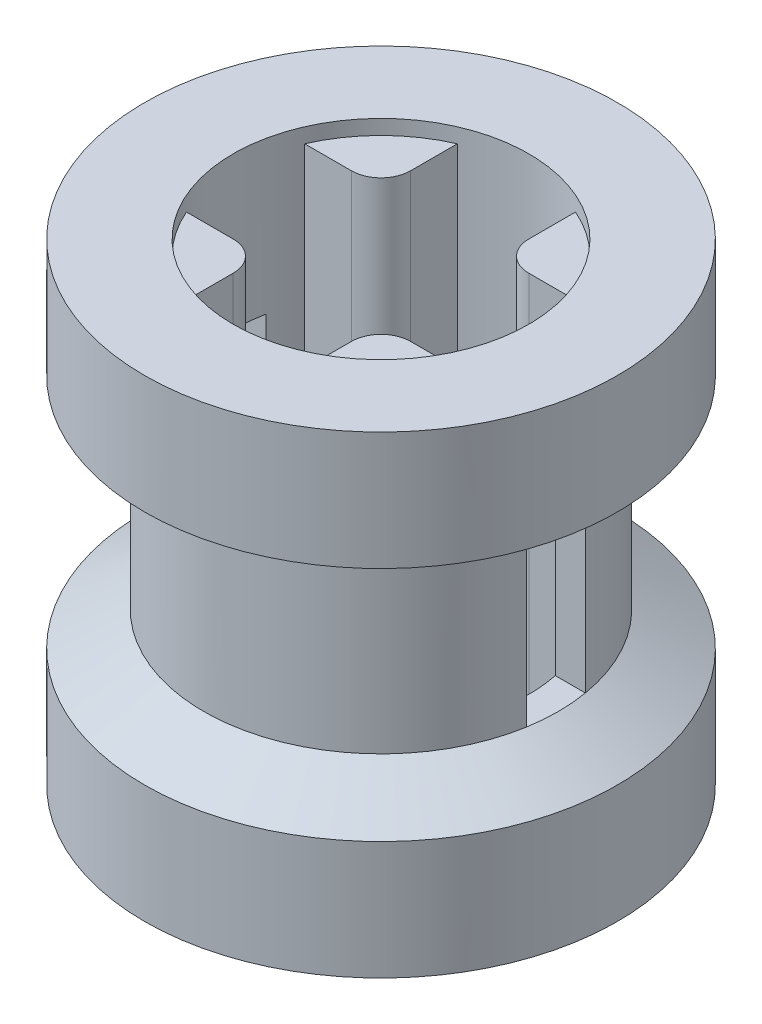
ISO-10303-21;
HEADER;
FILE_DESCRIPTION(('STEP AP214'),'2;1');
FILE_NAME('part.step','',(''),(''),'','','');
FILE_SCHEMA(('AUTOMOTIVE_DESIGN { 1 0 10303 214 1 1 1 1 }'));
ENDSEC;
DATA;
#1=APPLICATION_CONTEXT('core data for automotive mechanical design processes');
#2=APPLICATION_PROTOCOL_DEFINITION('international standard','automotive_design',2000,#1);
#3=PRODUCT_CONTEXT('',#1,'mechanical');
#4=PRODUCT('Part','Part','',(#3));
#5=PRODUCT_RELATED_PRODUCT_CATEGORY('part','',(#4));
#6=PRODUCT_DEFINITION_FORMATION('','',#4);
#7=PRODUCT_DEFINITION_CONTEXT('part definition',#1,'design');
#8=PRODUCT_DEFINITION('design','',#6,#7);
#9=PRODUCT_DEFINITION_SHAPE('','',#8);
#10=(LENGTH_UNIT() NAMED_UNIT(*) SI_UNIT(.MILLI.,.METRE.));
#11=(NAMED_UNIT(*) PLANE_ANGLE_UNIT() SI_UNIT($,.RADIAN.));
#12=(NAMED_UNIT(*) SI_UNIT($,.STERADIAN.) SOLID_ANGLE_UNIT());
#13=UNCERTAINTY_MEASURE_WITH_UNIT(LENGTH_MEASURE(1.E-05),#10,'distance_accuracy_value','');
#14=(GEOMETRIC_REPRESENTATION_CONTEXT(3) GLOBAL_UNCERTAINTY_ASSIGNED_CONTEXT((#13)) GLOBAL_UNIT_ASSIGNED_CONTEXT((#10,
#11,#12)) REPRESENTATION_CONTEXT('',''));
#15=CARTESIAN_POINT('',(0.,0.,0.));
#16=DIRECTION('',(0.,0.,1.));
#17=DIRECTION('',(1.,0.,0.));
#18=AXIS2_PLACEMENT_3D('',#15,#16,#17);
#19=CARTESIAN_POINT('',(0.,8.,0.));
#20=DIRECTION('',(0.,-1.,0.));
#21=DIRECTION('',(0.,0.,-1.));
#22=AXIS2_PLACEMENT_3D('',#19,#20,#21);
#23=CYLINDRICAL_SURFACE('',#22,2.5);
#24=CARTESIAN_POINT('',(0.,7.75,0.));
#25=DIRECTION('',(0.,1.,0.));
#26=DIRECTION('',(0.,0.,-1.));
#27=AXIS2_PLACEMENT_3D('',#24,#25,#26);
#28=CIRCLE('',#27,2.50000000000003);
#29=CARTESIAN_POINT('',(-1.00000000000005,7.75,-2.2912878474779));
#30=VERTEX_POINT('',#29);
#31=CARTESIAN_POINT('',(-2.29128784747792,7.75,-0.999999999999999));
#32=VERTEX_POINT('',#31);
#33=EDGE_CURVE('E377',#30,#32,#28,.T.);
#34=ORIENTED_EDGE('',*,*,#33,.F.);
#35=DIRECTION('',(0.,-1.,0.));
#36=VECTOR('',#35,1.);
#37=CARTESIAN_POINT('',(-1.00000000000005,7.75,-2.29128784747792));
#38=LINE('',#37,#36);
#39=CARTESIAN_POINT('',(-1.00000000000005,0.25,-2.29128784747792));
#40=VERTEX_POINT('',#39);
#41=EDGE_CURVE('E367',#30,#40,#38,.T.);
#42=ORIENTED_EDGE('',*,*,#41,.T.);
#43=CARTESIAN_POINT('',(0.,0.25,0.));
#44=DIRECTION('',(0.,1.,0.));
#45=DIRECTION('',(0.,0.,-1.));
#46=AXIS2_PLACEMENT_3D('',#43,#44,#45);
#47=CIRCLE('',#46,2.50000000000003);
#48=CARTESIAN_POINT('',(-2.29128784747793,0.25,-0.999999999999983));
#49=VERTEX_POINT('',#48);
#50=EDGE_CURVE('E325',#40,#49,#47,.T.);
#51=ORIENTED_EDGE('',*,*,#50,.T.);
#52=DIRECTION('',(0.,-1.,0.));
#53=VECTOR('',#52,1.);
#54=CARTESIAN_POINT('',(-2.29128784747797,7.75,-0.999999999999999));
#55=LINE('',#54,#53);
#56=EDGE_CURVE('E267',#32,#49,#55,.T.);
#57=ORIENTED_EDGE('',*,*,#56,.F.);
#58=EDGE_LOOP('',(#34,#42,#51,#57));
#59=FACE_BOUND('',#58,.T.);
#60=CARTESIAN_POINT('',(0.,7.75,0.));
#61=DIRECTION('',(0.,1.,0.));
#62=DIRECTION('',(0.,0.,-1.));
#63=AXIS2_PLACEMENT_3D('',#60,#61,#62);
#64=CIRCLE('',#63,2.50000000000003);
#65=CARTESIAN_POINT('',(-2.2912878474779,7.75,1.00000000000005));
#66=VERTEX_POINT('',#65);
#67=CARTESIAN_POINT('',(-1.00000000000004,7.75,2.2912878474779));
#68=VERTEX_POINT('',#67);
#69=EDGE_CURVE('E338',#66,#68,#64,.T.);
#70=ORIENTED_EDGE('',*,*,#69,.F.);
#71=DIRECTION('',(0.,-1.,0.));
#72=VECTOR('',#71,1.);
#73=CARTESIAN_POINT('',(-2.29128784747796,7.75,1.00000000000005));
#74=LINE('',#73,#72);
#75=CARTESIAN_POINT('',(-2.29128784747796,0.25,1.00000000000005));
#76=VERTEX_POINT('',#75);
#77=EDGE_CURVE('E329',#66,#76,#74,.T.);
#78=ORIENTED_EDGE('',*,*,#77,.T.);
#79=CARTESIAN_POINT('',(0.,0.25,0.));
#80=DIRECTION('',(0.,1.,0.));
#81=DIRECTION('',(0.,0.,-1.));
#82=AXIS2_PLACEMENT_3D('',#79,#80,#81);
#83=CIRCLE('',#82,2.50000000000003);
#84=CARTESIAN_POINT('',(-1.00000000000002,0.25,2.29128784747791));
#85=VERTEX_POINT('',#84);
#86=EDGE_CURVE('E279',#76,#85,#83,.T.);
#87=ORIENTED_EDGE('',*,*,#86,.T.);
#88=DIRECTION('',(0.,-1.,0.));
#89=VECTOR('',#88,1.);
#90=CARTESIAN_POINT('',(-1.00000000000004,7.75,2.29128784747797));
#91=LINE('',#90,#89);
#92=EDGE_CURVE('E320',#68,#85,#91,.T.);
#93=ORIENTED_EDGE('',*,*,#92,.F.);
#94=EDGE_LOOP('',(#70,#78,#87,#93));
#95=FACE_BOUND('',#94,.T.);
#96=CARTESIAN_POINT('',(0.,7.75,0.));
#97=DIRECTION('',(0.,1.,0.));
#98=DIRECTION('',(0.,0.,-1.));
#99=AXIS2_PLACEMENT_3D('',#96,#97,#98);
#100=CIRCLE('',#99,2.5);
#101=CARTESIAN_POINT('',(0.999999999999992,7.75,2.29128784747792));
#102=VERTEX_POINT('',#101);
#103=CARTESIAN_POINT('',(2.29128784747792,7.75,1.00000000000001));
#104=VERTEX_POINT('',#103);
#105=EDGE_CURVE('E293',#102,#104,#100,.T.);
#106=ORIENTED_EDGE('',*,*,#105,.F.);
#107=DIRECTION('',(0.,-1.,0.));
#108=VECTOR('',#107,1.);
#109=CARTESIAN_POINT('',(0.999999999999993,7.75,2.29128784747792));
#110=LINE('',#109,#108);
#111=CARTESIAN_POINT('',(0.999999999999993,0.25,2.29128784747792));
#112=VERTEX_POINT('',#111);
#113=EDGE_CURVE('E287',#102,#112,#110,.T.);
#114=ORIENTED_EDGE('',*,*,#113,.T.);
#115=CARTESIAN_POINT('',(0.,0.25,0.));
#116=DIRECTION('',(0.,1.,0.));
#117=DIRECTION('',(0.,0.,-1.));
#118=AXIS2_PLACEMENT_3D('',#115,#116,#117);
#119=CIRCLE('',#118,2.5);
#120=CARTESIAN_POINT('',(2.29128784747792,0.25,1.00000000000001));
#121=VERTEX_POINT('',#120);
#122=EDGE_CURVE('E302',#112,#121,#119,.T.);
#123=ORIENTED_EDGE('',*,*,#122,.T.);
#124=DIRECTION('',(0.,-1.,0.));
#125=VECTOR('',#124,1.);
#126=CARTESIAN_POINT('',(2.29128784747792,7.75,1.00000000000001));
#127=LINE('',#126,#125);
#128=EDGE_CURVE('E272',#104,#121,#127,.T.);
#129=ORIENTED_EDGE('',*,*,#128,.F.);
#130=EDGE_LOOP('',(#106,#114,#123,#129));
#131=FACE_BOUND('',#130,.T.);
#132=CARTESIAN_POINT('',(0.,7.75,0.));
#133=DIRECTION('',(0.,1.,0.));
#134=DIRECTION('',(0.,0.,-1.));
#135=AXIS2_PLACEMENT_3D('',#132,#133,#134);
#136=CIRCLE('',#135,2.50000000000003);
#137=CARTESIAN_POINT('',(2.29128784747792,7.75,-1.));
#138=VERTEX_POINT('',#137);
#139=CARTESIAN_POINT('',(0.999999999999999,7.75,-2.29128784747792));
#140=VERTEX_POINT('',#139);
#141=EDGE_CURVE('E396',#138,#140,#136,.T.);
#142=ORIENTED_EDGE('',*,*,#141,.F.);
#143=DIRECTION('',(0.,-1.,0.));
#144=VECTOR('',#143,1.);
#145=CARTESIAN_POINT('',(2.29128784747792,7.75,-1.));
#146=LINE('',#145,#144);
#147=CARTESIAN_POINT('',(2.29128784747792,0.25,-1.));
#148=VERTEX_POINT('',#147);
#149=EDGE_CURVE('E411',#138,#148,#146,.T.);
#150=ORIENTED_EDGE('',*,*,#149,.T.);
#151=CARTESIAN_POINT('',(0.,0.25,0.));
#152=DIRECTION('',(0.,1.,0.));
#153=DIRECTION('',(0.,0.,-1.));
#154=AXIS2_PLACEMENT_3D('',#151,#152,#153);
#155=CIRCLE('',#154,2.50000000000003);
#156=CARTESIAN_POINT('',(1.,0.25,-2.29128784747792));
#157=VERTEX_POINT('',#156);
#158=EDGE_CURVE('E301',#148,#157,#155,.T.);
#159=ORIENTED_EDGE('',*,*,#158,.T.);
#160=DIRECTION('',(0.,-1.,0.));
#161=VECTOR('',#160,1.);
#162=CARTESIAN_POINT('',(1.,7.75,-2.29128784747792));
#163=LINE('',#162,#161);
#164=EDGE_CURVE('E436',#140,#157,#163,.T.);
#165=ORIENTED_EDGE('',*,*,#164,.F.);
#166=EDGE_LOOP('',(#142,#150,#159,#165));
#167=FACE_BOUND('',#166,.T.);
#168=CARTESIAN_POINT('',(0.,8.,0.));
#169=DIRECTION('',(0.,1.,0.));
#170=DIRECTION('',(0.,0.,1.));
#171=AXIS2_PLACEMENT_3D('',#168,#169,#170);
#172=CIRCLE('',#171,2.5);
#173=CARTESIAN_POINT('',(0.,8.,2.5));
#174=VERTEX_POINT('',#173);
#175=EDGE_CURVE('E442',#174,#174,#172,.T.);
#176=ORIENTED_EDGE('',*,*,#175,.T.);
#177=EDGE_LOOP('',(#176));
#178=FACE_BOUND('',#177,.T.);
#179=CARTESIAN_POINT('',(0.,0.,0.));
#180=DIRECTION('',(0.,1.,0.));
#181=DIRECTION('',(0.,0.,1.));
#182=AXIS2_PLACEMENT_3D('',#179,#180,#181);
#183=CIRCLE('',#182,2.5);
#184=CARTESIAN_POINT('',(0.,0.,2.5));
#185=VERTEX_POINT('',#184);
#186=EDGE_CURVE('E439',#185,#185,#183,.T.);
#187=ORIENTED_EDGE('',*,*,#186,.F.);
#188=EDGE_LOOP('',(#187));
#189=FACE_BOUND('',#188,.T.);
#190=DIRECTION('',(0.,-1.,0.));
#191=VECTOR('',#190,1.);
#192=CARTESIAN_POINT('',(-2.44948974278318,8.,-0.5));
#193=LINE('',#192,#191);
#194=CARTESIAN_POINT('',(-2.44948974278318,5.42264973081038,-0.5));
#195=VERTEX_POINT('',#194);
#196=CARTESIAN_POINT('',(-2.44948974278318,2.57735026918963,-0.5));
#197=VERTEX_POINT('',#196);
#198=EDGE_CURVE('E235',#195,#197,#193,.T.);
#199=ORIENTED_EDGE('',*,*,#198,.T.);
#200=CARTESIAN_POINT('',(0.,2.57735026918963,0.));
#201=DIRECTION('',(0.,1.,0.));
#202=DIRECTION('',(0.,0.,1.));
#203=AXIS2_PLACEMENT_3D('',#200,#201,#202);
#204=CIRCLE('',#203,2.5);
#205=CARTESIAN_POINT('',(-2.44948974278318,2.57735026918963,0.5));
#206=VERTEX_POINT('',#205);
#207=EDGE_CURVE('E244',#197,#206,#204,.T.);
#208=ORIENTED_EDGE('',*,*,#207,.T.);
#209=DIRECTION('',(0.,-1.,0.));
#210=VECTOR('',#209,1.);
#211=CARTESIAN_POINT('',(-2.44948974278318,8.,0.5));
#212=LINE('',#211,#210);
#213=CARTESIAN_POINT('',(-2.44948974278318,5.42264973081038,0.5));
#214=VERTEX_POINT('',#213);
#215=EDGE_CURVE('E212',#206,#214,#212,.F.);
#216=ORIENTED_EDGE('',*,*,#215,.T.);
#217=CARTESIAN_POINT('',(0.,5.42264973081038,0.));
#218=DIRECTION('',(0.,-1.,0.));
#219=DIRECTION('',(0.,0.,-1.));
#220=AXIS2_PLACEMENT_3D('',#217,#218,#219);
#221=CIRCLE('',#220,2.5);
#222=EDGE_CURVE('E213',#214,#195,#221,.T.);
#223=ORIENTED_EDGE('',*,*,#222,.T.);
#224=EDGE_LOOP('',(#199,#208,#216,#223));
#225=FACE_BOUND('',#224,.T.);
#226=DIRECTION('',(0.,-1.,0.));
#227=VECTOR('',#226,1.);
#228=CARTESIAN_POINT('',(2.44948974278318,8.,0.5));
#229=LINE('',#228,#227);
#230=CARTESIAN_POINT('',(2.44948974278318,5.42264973081038,0.5));
#231=VERTEX_POINT('',#230);
#232=CARTESIAN_POINT('',(2.44948974278318,2.57735026918963,0.5));
#233=VERTEX_POINT('',#232);
#234=EDGE_CURVE('E204',#231,#233,#229,.T.);
#235=ORIENTED_EDGE('',*,*,#234,.T.);
#236=CARTESIAN_POINT('',(2.44948974278318,2.57735026918963,-0.5));
#237=VERTEX_POINT('',#236);
#238=EDGE_CURVE('E242',#233,#237,#204,.T.);
#239=ORIENTED_EDGE('',*,*,#238,.T.);
#240=DIRECTION('',(0.,-1.,0.));
#241=VECTOR('',#240,1.);
#242=CARTESIAN_POINT('',(2.44948974278318,8.,-0.5));
#243=LINE('',#242,#241);
#244=CARTESIAN_POINT('',(2.44948974278318,5.42264973081038,-0.5));
#245=VERTEX_POINT('',#244);
#246=EDGE_CURVE('E230',#237,#245,#243,.F.);
#247=ORIENTED_EDGE('',*,*,#246,.T.);
#248=EDGE_CURVE('E218',#245,#231,#221,.T.);
#249=ORIENTED_EDGE('',*,*,#248,.T.);
#250=EDGE_LOOP('',(#235,#239,#247,#249));
#251=FACE_BOUND('',#250,.T.);
#252=ADVANCED_FACE('F44',(#59,#95,#131,#167,#178,#189,#225,#251),#23,.F.);
#253=CARTESIAN_POINT('',(0.,8.,0.));
#254=DIRECTION('',(0.,-1.,0.));
#255=DIRECTION('',(0.,0.,-1.));
#256=AXIS2_PLACEMENT_3D('',#253,#254,#255);
#257=CYLINDRICAL_SURFACE('',#256,3.);
#258=DIRECTION('',(0.,-1.,0.));
#259=VECTOR('',#258,1.);
#260=CARTESIAN_POINT('',(-2.95803989154981,8.,-0.5));
#261=LINE('',#260,#259);
#262=CARTESIAN_POINT('',(-2.95803989154981,5.42264973081038,-0.5));
#263=VERTEX_POINT('',#262);
#264=CARTESIAN_POINT('',(-2.95803989154981,2.57735026918963,-0.5));
#265=VERTEX_POINT('',#264);
#266=EDGE_CURVE('E11',#263,#265,#261,.T.);
#267=ORIENTED_EDGE('',*,*,#266,.F.);
#268=CARTESIAN_POINT('',(0.,5.42264973081038,0.));
#269=DIRECTION('',(0.,-1.,0.));
#270=DIRECTION('',(0.,0.,-1.));
#271=AXIS2_PLACEMENT_3D('',#268,#269,#270);
#272=CIRCLE('',#271,3.);
#273=CARTESIAN_POINT('',(2.95803989154981,5.42264973081038,-0.5));
#274=VERTEX_POINT('',#273);
#275=EDGE_CURVE('E260',#263,#274,#272,.T.);
#276=ORIENTED_EDGE('',*,*,#275,.T.);
#277=DIRECTION('',(0.,-1.,0.));
#278=VECTOR('',#277,1.);
#279=CARTESIAN_POINT('',(2.95803989154981,8.,-0.5));
#280=LINE('',#279,#278);
#281=CARTESIAN_POINT('',(2.95803989154981,2.57735026918963,-0.5));
#282=VERTEX_POINT('',#281);
#283=EDGE_CURVE('E53',#282,#274,#280,.F.);
#284=ORIENTED_EDGE('',*,*,#283,.F.);
#285=CARTESIAN_POINT('',(0.,2.57735026918963,0.));
#286=DIRECTION('',(0.,-1.,0.));
#287=DIRECTION('',(0.,0.,-1.));
#288=AXIS2_PLACEMENT_3D('',#285,#286,#287);
#289=CIRCLE('',#288,3.);
#290=EDGE_CURVE('E252',#265,#282,#289,.T.);
#291=ORIENTED_EDGE('',*,*,#290,.F.);
#292=EDGE_LOOP('',(#267,#276,#284,#291));
#293=FACE_BOUND('',#292,.T.);
#294=ADVANCED_FACE('F50',(#293),#257,.T.);
#295=DIRECTION('',(0.,-1.,0.));
#296=VECTOR('',#295,1.);
#297=CARTESIAN_POINT('',(2.95803989154981,8.,0.5));
#298=LINE('',#297,#296);
#299=CARTESIAN_POINT('',(2.95803989154981,5.42264973081038,0.5));
#300=VERTEX_POINT('',#299);
#301=CARTESIAN_POINT('',(2.95803989154981,2.57735026918963,0.5));
#302=VERTEX_POINT('',#301);
#303=EDGE_CURVE('E452',#300,#302,#298,.T.);
#304=ORIENTED_EDGE('',*,*,#303,.F.);
#305=CARTESIAN_POINT('',(-2.95803989154981,5.42264973081038,0.5));
#306=VERTEX_POINT('',#305);
#307=EDGE_CURVE('E258',#300,#306,#272,.T.);
#308=ORIENTED_EDGE('',*,*,#307,.T.);
#309=DIRECTION('',(0.,-1.,0.));
#310=VECTOR('',#309,1.);
#311=CARTESIAN_POINT('',(-2.95803989154981,8.,0.5));
#312=LINE('',#311,#310);
#313=CARTESIAN_POINT('',(-2.95803989154981,2.57735026918963,0.5));
#314=VERTEX_POINT('',#313);
#315=EDGE_CURVE('E443',#314,#306,#312,.F.);
#316=ORIENTED_EDGE('',*,*,#315,.F.);
#317=EDGE_CURVE('E253',#302,#314,#289,.T.);
#318=ORIENTED_EDGE('',*,*,#317,.F.);
#319=EDGE_LOOP('',(#304,#308,#316,#318));
#320=FACE_BOUND('',#319,.T.);
#321=ADVANCED_FACE('F513',(#320),#257,.T.);
#322=CARTESIAN_POINT('',(0.,8.,0.));
#323=DIRECTION('',(0.,1.,0.));
#324=DIRECTION('',(0.,0.,1.));
#325=AXIS2_PLACEMENT_3D('',#322,#323,#324);
#326=PLANE('',#325);
#327=ORIENTED_EDGE('',*,*,#175,.F.);
#328=EDGE_LOOP('',(#327));
#329=FACE_BOUND('',#328,.T.);
#330=CARTESIAN_POINT('',(0.,8.,0.));
#331=DIRECTION('',(0.,1.,0.));
#332=DIRECTION('',(0.,0.,1.));
#333=AXIS2_PLACEMENT_3D('',#330,#331,#332);
#334=CIRCLE('',#333,4.);
#335=CARTESIAN_POINT('',(0.,8.,4.));
#336=VERTEX_POINT('',#335);
#337=EDGE_CURVE('E248',#336,#336,#334,.T.);
#338=ORIENTED_EDGE('',*,*,#337,.T.);
#339=EDGE_LOOP('',(#338));
#340=FACE_BOUND('',#339,.T.);
#341=ADVANCED_FACE('F541',(#329,#340),#326,.T.);
#342=CARTESIAN_POINT('',(0.,0.,0.));
#343=DIRECTION('',(0.,1.,0.));
#344=DIRECTION('',(0.,0.,1.));
#345=AXIS2_PLACEMENT_3D('',#342,#343,#344);
#346=PLANE('',#345);
#347=ORIENTED_EDGE('',*,*,#186,.T.);
#348=EDGE_LOOP('',(#347));
#349=FACE_BOUND('',#348,.T.);
#350=CARTESIAN_POINT('',(0.,0.,0.));
#351=DIRECTION('',(0.,1.,0.));
#352=DIRECTION('',(0.,0.,1.));
#353=AXIS2_PLACEMENT_3D('',#350,#351,#352);
#354=CIRCLE('',#353,4.);
#355=CARTESIAN_POINT('',(0.,0.,4.));
#356=VERTEX_POINT('',#355);
#357=EDGE_CURVE('E262',#356,#356,#354,.T.);
#358=ORIENTED_EDGE('',*,*,#357,.F.);
#359=EDGE_LOOP('',(#358));
#360=FACE_BOUND('',#359,.T.);
#361=ADVANCED_FACE('F543',(#349,#360),#346,.F.);
#362=CARTESIAN_POINT('',(1.,7.75,-2.29128784747792));
#363=DIRECTION('',(1.,0.,0.));
#364=DIRECTION('',(0.,0.,-1.));
#365=AXIS2_PLACEMENT_3D('',#362,#363,#364);
#366=PLANE('',#365);
#367=DIRECTION('',(0.,0.,1.));
#368=VECTOR('',#367,1.);
#369=CARTESIAN_POINT('',(1.,0.25,-2.29128784747792));
#370=LINE('',#369,#368);
#371=CARTESIAN_POINT('',(1.,0.25,-1.5));
#372=VERTEX_POINT('',#371);
#373=EDGE_CURVE('E417',#157,#372,#370,.T.);
#374=ORIENTED_EDGE('',*,*,#373,.T.);
#375=DIRECTION('',(0.,-1.,0.));
#376=VECTOR('',#375,1.);
#377=CARTESIAN_POINT('',(1.,7.75,-1.5));
#378=LINE('',#377,#376);
#379=CARTESIAN_POINT('',(1.,7.75,-1.5));
#380=VERTEX_POINT('',#379);
#381=EDGE_CURVE('E435',#380,#372,#378,.T.);
#382=ORIENTED_EDGE('',*,*,#381,.F.);
#383=DIRECTION('',(0.,0.,1.));
#384=VECTOR('',#383,1.);
#385=CARTESIAN_POINT('',(1.,7.75,-2.29128784747792));
#386=LINE('',#385,#384);
#387=EDGE_CURVE('E401',#140,#380,#386,.T.);
#388=ORIENTED_EDGE('',*,*,#387,.F.);
#389=ORIENTED_EDGE('',*,*,#164,.T.);
#390=EDGE_LOOP('',(#374,#382,#388,#389));
#391=FACE_BOUND('',#390,.T.);
#392=ADVANCED_FACE('F537',(#391),#366,.F.);
#393=CARTESIAN_POINT('',(1.5,7.75,-1.5));
#394=DIRECTION('',(0.,-1.,0.));
#395=DIRECTION('',(0.,0.,-1.));
#396=AXIS2_PLACEMENT_3D('',#393,#394,#395);
#397=CYLINDRICAL_SURFACE('',#396,0.5);
#398=CARTESIAN_POINT('',(1.5,0.25,-1.5));
#399=DIRECTION('',(0.,1.,0.));
#400=DIRECTION('',(0.,0.,1.));
#401=AXIS2_PLACEMENT_3D('',#398,#399,#400);
#402=CIRCLE('',#401,0.5);
#403=CARTESIAN_POINT('',(1.5,0.25,-1.));
#404=VERTEX_POINT('',#403);
#405=EDGE_CURVE('E419',#372,#404,#402,.T.);
#406=ORIENTED_EDGE('',*,*,#405,.T.);
#407=DIRECTION('',(0.,-1.,0.));
#408=VECTOR('',#407,1.);
#409=CARTESIAN_POINT('',(1.5,7.75,-1.));
#410=LINE('',#409,#408);
#411=CARTESIAN_POINT('',(1.5,7.75,-1.));
#412=VERTEX_POINT('',#411);
#413=EDGE_CURVE('E428',#412,#404,#410,.T.);
#414=ORIENTED_EDGE('',*,*,#413,.F.);
#415=CARTESIAN_POINT('',(1.5,7.75,-1.5));
#416=DIRECTION('',(0.,1.,0.));
#417=DIRECTION('',(0.,0.,1.));
#418=AXIS2_PLACEMENT_3D('',#415,#416,#417);
#419=CIRCLE('',#418,0.5);
#420=EDGE_CURVE('E406',#380,#412,#419,.T.);
#421=ORIENTED_EDGE('',*,*,#420,.F.);
#422=ORIENTED_EDGE('',*,*,#381,.T.);
#423=EDGE_LOOP('',(#406,#414,#421,#422));
#424=FACE_BOUND('',#423,.T.);
#425=ADVANCED_FACE('F555',(#424),#397,.T.);
#426=CARTESIAN_POINT('',(2.29128784747792,7.75,-1.));
#427=DIRECTION('',(0.,0.,-1.));
#428=DIRECTION('',(-1.,0.,0.));
#429=AXIS2_PLACEMENT_3D('',#426,#427,#428);
#430=PLANE('',#429);
#431=DIRECTION('',(1.,0.,0.));
#432=VECTOR('',#431,1.);
#433=CARTESIAN_POINT('',(2.29128784747792,0.25,-1.));
#434=LINE('',#433,#432);
#435=EDGE_CURVE('E404',#404,#148,#434,.T.);
#436=ORIENTED_EDGE('',*,*,#435,.T.);
#437=ORIENTED_EDGE('',*,*,#149,.F.);
#438=DIRECTION('',(1.,0.,0.));
#439=VECTOR('',#438,1.);
#440=CARTESIAN_POINT('',(2.29128784747792,7.75,-1.));
#441=LINE('',#440,#439);
#442=EDGE_CURVE('E407',#412,#138,#441,.T.);
#443=ORIENTED_EDGE('',*,*,#442,.F.);
#444=ORIENTED_EDGE('',*,*,#413,.T.);
#445=EDGE_LOOP('',(#436,#437,#443,#444));
#446=FACE_BOUND('',#445,.T.);
#447=ADVANCED_FACE('F634',(#446),#430,.F.);
#448=CARTESIAN_POINT('',(0.,7.75,0.));
#449=DIRECTION('',(0.,-1.,0.));
#450=DIRECTION('',(0.,0.,-1.));
#451=AXIS2_PLACEMENT_3D('',#448,#449,#450);
#452=PLANE('',#451);
#453=ORIENTED_EDGE('',*,*,#141,.T.);
#454=ORIENTED_EDGE('',*,*,#387,.T.);
#455=ORIENTED_EDGE('',*,*,#420,.T.);
#456=ORIENTED_EDGE('',*,*,#442,.T.);
#457=EDGE_LOOP('',(#453,#454,#455,#456));
#458=FACE_BOUND('',#457,.T.);
#459=ADVANCED_FACE('F628',(#458),#452,.F.);
#460=CARTESIAN_POINT('',(0.,0.25,0.));
#461=DIRECTION('',(0.,-1.,0.));
#462=DIRECTION('',(0.,0.,-1.));
#463=AXIS2_PLACEMENT_3D('',#460,#461,#462);
#464=PLANE('',#463);
#465=ORIENTED_EDGE('',*,*,#158,.F.);
#466=ORIENTED_EDGE('',*,*,#435,.F.);
#467=ORIENTED_EDGE('',*,*,#405,.F.);
#468=ORIENTED_EDGE('',*,*,#373,.F.);
#469=EDGE_LOOP('',(#465,#466,#467,#468));
#470=FACE_BOUND('',#469,.T.);
#471=ADVANCED_FACE('F579',(#470),#464,.T.);
#472=CARTESIAN_POINT('',(2.29128784747792,7.75,1.00000000000001));
#473=DIRECTION('',(0.,0.,1.));
#474=DIRECTION('',(1.,0.,0.));
#475=AXIS2_PLACEMENT_3D('',#472,#473,#474);
#476=PLANE('',#475);
#477=DIRECTION('',(-1.,0.,0.));
#478=VECTOR('',#477,1.);
#479=CARTESIAN_POINT('',(2.29128784747792,0.25,1.00000000000001));
#480=LINE('',#479,#478);
#481=CARTESIAN_POINT('',(1.5,0.25,1.));
#482=VERTEX_POINT('',#481);
#483=EDGE_CURVE('E300',#121,#482,#480,.T.);
#484=ORIENTED_EDGE('',*,*,#483,.T.);
#485=DIRECTION('',(0.,-1.,0.));
#486=VECTOR('',#485,1.);
#487=CARTESIAN_POINT('',(1.5,7.75,1.));
#488=LINE('',#487,#486);
#489=CARTESIAN_POINT('',(1.5,7.75,1.));
#490=VERTEX_POINT('',#489);
#491=EDGE_CURVE('E280',#490,#482,#488,.T.);
#492=ORIENTED_EDGE('',*,*,#491,.F.);
#493=DIRECTION('',(-1.,0.,0.));
#494=VECTOR('',#493,1.);
#495=CARTESIAN_POINT('',(2.29128784747792,7.75,1.00000000000001));
#496=LINE('',#495,#494);
#497=EDGE_CURVE('E313',#104,#490,#496,.T.);
#498=ORIENTED_EDGE('',*,*,#497,.F.);
#499=ORIENTED_EDGE('',*,*,#128,.T.);
#500=EDGE_LOOP('',(#484,#492,#498,#499));
#501=FACE_BOUND('',#500,.T.);
#502=ADVANCED_FACE('F575',(#501),#476,.F.);
#503=CARTESIAN_POINT('',(1.5,7.75,1.5));
#504=DIRECTION('',(0.,-1.,0.));
#505=DIRECTION('',(0.,0.,-1.));
#506=AXIS2_PLACEMENT_3D('',#503,#504,#505);
#507=CYLINDRICAL_SURFACE('',#506,0.5);
#508=CARTESIAN_POINT('',(1.5,0.25,1.5));
#509=DIRECTION('',(0.,1.,0.));
#510=DIRECTION('',(0.,0.,1.));
#511=AXIS2_PLACEMENT_3D('',#508,#509,#510);
#512=CIRCLE('',#511,0.5);
#513=CARTESIAN_POINT('',(0.999999999999995,0.25,1.5));
#514=VERTEX_POINT('',#513);
#515=EDGE_CURVE('E294',#482,#514,#512,.T.);
#516=ORIENTED_EDGE('',*,*,#515,.T.);
#517=DIRECTION('',(0.,-1.,0.));
#518=VECTOR('',#517,1.);
#519=CARTESIAN_POINT('',(0.999999999999995,7.75,1.5));
#520=LINE('',#519,#518);
#521=CARTESIAN_POINT('',(0.999999999999995,7.75,1.5));
#522=VERTEX_POINT('',#521);
#523=EDGE_CURVE('E281',#522,#514,#520,.T.);
#524=ORIENTED_EDGE('',*,*,#523,.F.);
#525=CARTESIAN_POINT('',(1.5,7.75,1.5));
#526=DIRECTION('',(0.,1.,0.));
#527=DIRECTION('',(0.,0.,1.));
#528=AXIS2_PLACEMENT_3D('',#525,#526,#527);
#529=CIRCLE('',#528,0.5);
#530=EDGE_CURVE('E306',#490,#522,#529,.T.);
#531=ORIENTED_EDGE('',*,*,#530,.F.);
#532=ORIENTED_EDGE('',*,*,#491,.T.);
#533=EDGE_LOOP('',(#516,#524,#531,#532));
#534=FACE_BOUND('',#533,.T.);
#535=ADVANCED_FACE('F577',(#534),#507,.T.);
#536=CARTESIAN_POINT('',(0.999999999999993,7.75,2.29128784747792));
#537=DIRECTION('',(1.,0.,0.));
#538=DIRECTION('',(0.,0.,-1.));
#539=AXIS2_PLACEMENT_3D('',#536,#537,#538);
#540=PLANE('',#539);
#541=DIRECTION('',(0.,0.,1.));
#542=VECTOR('',#541,1.);
#543=CARTESIAN_POINT('',(0.999999999999993,0.25,2.29128784747792));
#544=LINE('',#543,#542);
#545=EDGE_CURVE('E288',#514,#112,#544,.T.);
#546=ORIENTED_EDGE('',*,*,#545,.T.);
#547=ORIENTED_EDGE('',*,*,#113,.F.);
#548=DIRECTION('',(0.,0.,1.));
#549=VECTOR('',#548,1.);
#550=CARTESIAN_POINT('',(0.999999999999993,7.75,2.29128784747792));
#551=LINE('',#550,#549);
#552=EDGE_CURVE('E286',#522,#102,#551,.T.);
#553=ORIENTED_EDGE('',*,*,#552,.F.);
#554=ORIENTED_EDGE('',*,*,#523,.T.);
#555=EDGE_LOOP('',(#546,#547,#553,#554));
#556=FACE_BOUND('',#555,.T.);
#557=ADVANCED_FACE('F583',(#556),#540,.F.);
#558=CARTESIAN_POINT('',(0.,7.75,0.));
#559=DIRECTION('',(0.,-1.,0.));
#560=DIRECTION('',(0.,0.,-1.));
#561=AXIS2_PLACEMENT_3D('',#558,#559,#560);
#562=PLANE('',#561);
#563=ORIENTED_EDGE('',*,*,#105,.T.);
#564=ORIENTED_EDGE('',*,*,#497,.T.);
#565=ORIENTED_EDGE('',*,*,#530,.T.);
#566=ORIENTED_EDGE('',*,*,#552,.T.);
#567=EDGE_LOOP('',(#563,#564,#565,#566));
#568=FACE_BOUND('',#567,.T.);
#569=ADVANCED_FACE('F584',(#568),#562,.F.);
#570=CARTESIAN_POINT('',(0.,0.25,0.));
#571=DIRECTION('',(0.,-1.,0.));
#572=DIRECTION('',(0.,0.,-1.));
#573=AXIS2_PLACEMENT_3D('',#570,#571,#572);
#574=PLANE('',#573);
#575=ORIENTED_EDGE('',*,*,#122,.F.);
#576=ORIENTED_EDGE('',*,*,#545,.F.);
#577=ORIENTED_EDGE('',*,*,#515,.F.);
#578=ORIENTED_EDGE('',*,*,#483,.F.);
#579=EDGE_LOOP('',(#575,#576,#577,#578));
#580=FACE_BOUND('',#579,.T.);
#581=ADVANCED_FACE('F590',(#580),#574,.T.);
#582=CARTESIAN_POINT('',(-1.00000000000004,7.75,2.29128784747797));
#583=DIRECTION('',(-1.,0.,0.));
#584=DIRECTION('',(0.,0.,1.));
#585=AXIS2_PLACEMENT_3D('',#582,#583,#584);
#586=PLANE('',#585);
#587=DIRECTION('',(0.,0.,-1.));
#588=VECTOR('',#587,1.);
#589=CARTESIAN_POINT('',(-1.00000000000004,0.25,2.29128784747797));
#590=LINE('',#589,#588);
#591=CARTESIAN_POINT('',(-1.00000000000004,0.25,1.50000000000005));
#592=VERTEX_POINT('',#591);
#593=EDGE_CURVE('E344',#85,#592,#590,.T.);
#594=ORIENTED_EDGE('',*,*,#593,.T.);
#595=DIRECTION('',(0.,-1.,0.));
#596=VECTOR('',#595,1.);
#597=CARTESIAN_POINT('',(-1.00000000000004,7.75,1.50000000000005));
#598=LINE('',#597,#596);
#599=CARTESIAN_POINT('',(-1.00000000000004,7.75,1.50000000000005));
#600=VERTEX_POINT('',#599);
#601=EDGE_CURVE('E321',#600,#592,#598,.T.);
#602=ORIENTED_EDGE('',*,*,#601,.F.);
#603=DIRECTION('',(0.,0.,-1.));
#604=VECTOR('',#603,1.);
#605=CARTESIAN_POINT('',(-1.00000000000004,7.75,2.29128784747797));
#606=LINE('',#605,#604);
#607=EDGE_CURVE('E355',#68,#600,#606,.T.);
#608=ORIENTED_EDGE('',*,*,#607,.F.);
#609=ORIENTED_EDGE('',*,*,#92,.T.);
#610=EDGE_LOOP('',(#594,#602,#608,#609));
#611=FACE_BOUND('',#610,.T.);
#612=ADVANCED_FACE('F587',(#611),#586,.F.);
#613=CARTESIAN_POINT('',(-1.50000000000004,7.75,1.50000000000005));
#614=DIRECTION('',(0.,-1.,0.));
#615=DIRECTION('',(0.,0.,-1.));
#616=AXIS2_PLACEMENT_3D('',#613,#614,#615);
#617=CYLINDRICAL_SURFACE('',#616,0.5);
#618=CARTESIAN_POINT('',(-1.50000000000004,0.25,1.50000000000005));
#619=DIRECTION('',(0.,1.,0.));
#620=DIRECTION('',(0.,0.,1.));
#621=AXIS2_PLACEMENT_3D('',#618,#619,#620);
#622=CIRCLE('',#621,0.5);
#623=CARTESIAN_POINT('',(-1.50000000000004,0.25,1.00000000000005));
#624=VERTEX_POINT('',#623);
#625=EDGE_CURVE('E340',#592,#624,#622,.T.);
#626=ORIENTED_EDGE('',*,*,#625,.T.);
#627=DIRECTION('',(0.,-1.,0.));
#628=VECTOR('',#627,1.);
#629=CARTESIAN_POINT('',(-1.50000000000004,7.75,1.00000000000005));
#630=LINE('',#629,#628);
#631=CARTESIAN_POINT('',(-1.50000000000004,7.75,1.00000000000005));
#632=VERTEX_POINT('',#631);
#633=EDGE_CURVE('E326',#632,#624,#630,.T.);
#634=ORIENTED_EDGE('',*,*,#633,.F.);
#635=CARTESIAN_POINT('',(-1.50000000000004,7.75,1.50000000000005));
#636=DIRECTION('',(0.,1.,0.));
#637=DIRECTION('',(0.,0.,1.));
#638=AXIS2_PLACEMENT_3D('',#635,#636,#637);
#639=CIRCLE('',#638,0.5);
#640=EDGE_CURVE('E348',#600,#632,#639,.T.);
#641=ORIENTED_EDGE('',*,*,#640,.F.);
#642=ORIENTED_EDGE('',*,*,#601,.T.);
#643=EDGE_LOOP('',(#626,#634,#641,#642));
#644=FACE_BOUND('',#643,.T.);
#645=ADVANCED_FACE('F600',(#644),#617,.T.);
#646=CARTESIAN_POINT('',(-2.29128784747796,7.75,1.00000000000005));
#647=DIRECTION('',(0.,0.,1.));
#648=DIRECTION('',(1.,0.,0.));
#649=AXIS2_PLACEMENT_3D('',#646,#647,#648);
#650=PLANE('',#649);
#651=DIRECTION('',(-1.,0.,0.));
#652=VECTOR('',#651,1.);
#653=CARTESIAN_POINT('',(-2.29128784747796,0.25,1.00000000000005));
#654=LINE('',#653,#652);
#655=EDGE_CURVE('E331',#624,#76,#654,.T.);
#656=ORIENTED_EDGE('',*,*,#655,.T.);
#657=ORIENTED_EDGE('',*,*,#77,.F.);
#658=DIRECTION('',(-1.,0.,0.));
#659=VECTOR('',#658,1.);
#660=CARTESIAN_POINT('',(-2.29128784747796,7.75,1.00000000000005));
#661=LINE('',#660,#659);
#662=EDGE_CURVE('E334',#632,#66,#661,.T.);
#663=ORIENTED_EDGE('',*,*,#662,.F.);
#664=ORIENTED_EDGE('',*,*,#633,.T.);
#665=EDGE_LOOP('',(#656,#657,#663,#664));
#666=FACE_BOUND('',#665,.T.);
#667=ADVANCED_FACE('F601',(#666),#650,.F.);
#668=CARTESIAN_POINT('',(0.,7.75,0.));
#669=DIRECTION('',(0.,-1.,0.));
#670=DIRECTION('',(0.,0.,-1.));
#671=AXIS2_PLACEMENT_3D('',#668,#669,#670);
#672=PLANE('',#671);
#673=ORIENTED_EDGE('',*,*,#69,.T.);
#674=ORIENTED_EDGE('',*,*,#607,.T.);
#675=ORIENTED_EDGE('',*,*,#640,.T.);
#676=ORIENTED_EDGE('',*,*,#662,.T.);
#677=EDGE_LOOP('',(#673,#674,#675,#676));
#678=FACE_BOUND('',#677,.T.);
#679=ADVANCED_FACE('F604',(#678),#672,.F.);
#680=CARTESIAN_POINT('',(0.,0.25,0.));
#681=DIRECTION('',(0.,-1.,0.));
#682=DIRECTION('',(0.,0.,-1.));
#683=AXIS2_PLACEMENT_3D('',#680,#681,#682);
#684=PLANE('',#683);
#685=ORIENTED_EDGE('',*,*,#86,.F.);
#686=ORIENTED_EDGE('',*,*,#655,.F.);
#687=ORIENTED_EDGE('',*,*,#625,.F.);
#688=ORIENTED_EDGE('',*,*,#593,.F.);
#689=EDGE_LOOP('',(#685,#686,#687,#688));
#690=FACE_BOUND('',#689,.T.);
#691=ADVANCED_FACE('F610',(#690),#684,.T.);
#692=CARTESIAN_POINT('',(-2.29128784747797,7.75,-0.999999999999999));
#693=DIRECTION('',(0.,0.,-1.));
#694=DIRECTION('',(-1.,0.,0.));
#695=AXIS2_PLACEMENT_3D('',#692,#693,#694);
#696=PLANE('',#695);
#697=DIRECTION('',(1.,0.,0.));
#698=VECTOR('',#697,1.);
#699=CARTESIAN_POINT('',(-2.29128784747797,0.25,-0.999999999999999));
#700=LINE('',#699,#698);
#701=CARTESIAN_POINT('',(-1.50000000000005,0.25,-0.999999999999999));
#702=VERTEX_POINT('',#701);
#703=EDGE_CURVE('E385',#49,#702,#700,.T.);
#704=ORIENTED_EDGE('',*,*,#703,.T.);
#705=DIRECTION('',(0.,-1.,0.));
#706=VECTOR('',#705,1.);
#707=CARTESIAN_POINT('',(-1.50000000000005,7.75,-0.999999999999999));
#708=LINE('',#707,#706);
#709=CARTESIAN_POINT('',(-1.50000000000005,7.75,-0.999999999999999));
#710=VERTEX_POINT('',#709);
#711=EDGE_CURVE('E362',#710,#702,#708,.T.);
#712=ORIENTED_EDGE('',*,*,#711,.F.);
#713=DIRECTION('',(1.,0.,0.));
#714=VECTOR('',#713,1.);
#715=CARTESIAN_POINT('',(-2.29128784747797,7.75,-0.999999999999999));
#716=LINE('',#715,#714);
#717=EDGE_CURVE('E395',#32,#710,#716,.T.);
#718=ORIENTED_EDGE('',*,*,#717,.F.);
#719=ORIENTED_EDGE('',*,*,#56,.T.);
#720=EDGE_LOOP('',(#704,#712,#718,#719));
#721=FACE_BOUND('',#720,.T.);
#722=ADVANCED_FACE('F608',(#721),#696,.F.);
#723=CARTESIAN_POINT('',(-1.50000000000004,7.75,-1.5));
#724=DIRECTION('',(0.,-1.,0.));
#725=DIRECTION('',(0.,0.,-1.));
#726=AXIS2_PLACEMENT_3D('',#723,#724,#725);
#727=CYLINDRICAL_SURFACE('',#726,0.5);
#728=CARTESIAN_POINT('',(-1.50000000000004,0.25,-1.5));
#729=DIRECTION('',(0.,1.,0.));
#730=DIRECTION('',(0.,0.,1.));
#731=AXIS2_PLACEMENT_3D('',#728,#729,#730);
#732=CIRCLE('',#731,0.5);
#733=CARTESIAN_POINT('',(-1.00000000000004,0.25,-1.5));
#734=VERTEX_POINT('',#733);
#735=EDGE_CURVE('E378',#702,#734,#732,.T.);
#736=ORIENTED_EDGE('',*,*,#735,.T.);
#737=DIRECTION('',(0.,-1.,0.));
#738=VECTOR('',#737,1.);
#739=CARTESIAN_POINT('',(-1.00000000000004,7.75,-1.5));
#740=LINE('',#739,#738);
#741=CARTESIAN_POINT('',(-1.00000000000004,7.75,-1.5));
#742=VERTEX_POINT('',#741);
#743=EDGE_CURVE('E368',#742,#734,#740,.T.);
#744=ORIENTED_EDGE('',*,*,#743,.F.);
#745=CARTESIAN_POINT('',(-1.50000000000004,7.75,-1.5));
#746=DIRECTION('',(0.,1.,0.));
#747=DIRECTION('',(0.,0.,1.));
#748=AXIS2_PLACEMENT_3D('',#745,#746,#747);
#749=CIRCLE('',#748,0.5);
#750=EDGE_CURVE('E388',#710,#742,#749,.T.);
#751=ORIENTED_EDGE('',*,*,#750,.F.);
#752=ORIENTED_EDGE('',*,*,#711,.T.);
#753=EDGE_LOOP('',(#736,#744,#751,#752));
#754=FACE_BOUND('',#753,.T.);
#755=ADVANCED_FACE('F619',(#754),#727,.T.);
#756=CARTESIAN_POINT('',(-1.00000000000005,7.75,-2.29128784747792));
#757=DIRECTION('',(-1.,0.,0.));
#758=DIRECTION('',(0.,0.,1.));
#759=AXIS2_PLACEMENT_3D('',#756,#757,#758);
#760=PLANE('',#759);
#761=DIRECTION('',(0.,0.,-1.));
#762=VECTOR('',#761,1.);
#763=CARTESIAN_POINT('',(-1.00000000000005,0.25,-2.29128784747792));
#764=LINE('',#763,#762);
#765=EDGE_CURVE('E372',#734,#40,#764,.T.);
#766=ORIENTED_EDGE('',*,*,#765,.T.);
#767=ORIENTED_EDGE('',*,*,#41,.F.);
#768=DIRECTION('',(0.,0.,-1.));
#769=VECTOR('',#768,1.);
#770=CARTESIAN_POINT('',(-1.00000000000005,7.75,-2.29128784747792));
#771=LINE('',#770,#769);
#772=EDGE_CURVE('E373',#742,#30,#771,.T.);
#773=ORIENTED_EDGE('',*,*,#772,.F.);
#774=ORIENTED_EDGE('',*,*,#743,.T.);
#775=EDGE_LOOP('',(#766,#767,#773,#774));
#776=FACE_BOUND('',#775,.T.);
#777=ADVANCED_FACE('F622',(#776),#760,.F.);
#778=CARTESIAN_POINT('',(0.,7.75,0.));
#779=DIRECTION('',(0.,-1.,0.));
#780=DIRECTION('',(0.,0.,-1.));
#781=AXIS2_PLACEMENT_3D('',#778,#779,#780);
#782=PLANE('',#781);
#783=ORIENTED_EDGE('',*,*,#33,.T.);
#784=ORIENTED_EDGE('',*,*,#717,.T.);
#785=ORIENTED_EDGE('',*,*,#750,.T.);
#786=ORIENTED_EDGE('',*,*,#772,.T.);
#787=EDGE_LOOP('',(#783,#784,#785,#786));
#788=FACE_BOUND('',#787,.T.);
#789=ADVANCED_FACE('F570',(#788),#782,.F.);
#790=CARTESIAN_POINT('',(0.,0.25,0.));
#791=DIRECTION('',(0.,-1.,0.));
#792=DIRECTION('',(0.,0.,-1.));
#793=AXIS2_PLACEMENT_3D('',#790,#791,#792);
#794=PLANE('',#793);
#795=ORIENTED_EDGE('',*,*,#50,.F.);
#796=ORIENTED_EDGE('',*,*,#765,.F.);
#797=ORIENTED_EDGE('',*,*,#735,.F.);
#798=ORIENTED_EDGE('',*,*,#703,.F.);
#799=EDGE_LOOP('',(#795,#796,#797,#798));
#800=FACE_BOUND('',#799,.T.);
#801=ADVANCED_FACE('F557',(#800),#794,.T.);
#802=CARTESIAN_POINT('',(0.,2.,0.));
#803=DIRECTION('',(0.,-1.,0.));
#804=DIRECTION('',(0.,0.,-1.));
#805=AXIS2_PLACEMENT_3D('',#802,#803,#804);
#806=CYLINDRICAL_SURFACE('',#805,4.);
#807=CARTESIAN_POINT('',(0.,2.,0.));
#808=DIRECTION('',(0.,1.,0.));
#809=DIRECTION('',(0.,0.,1.));
#810=AXIS2_PLACEMENT_3D('',#807,#808,#809);
#811=CIRCLE('',#810,4.);
#812=CARTESIAN_POINT('',(0.,2.,4.));
#813=VERTEX_POINT('',#812);
#814=EDGE_CURVE('E264',#813,#813,#811,.T.);
#815=ORIENTED_EDGE('',*,*,#814,.F.);
#816=EDGE_LOOP('',(#815));
#817=FACE_BOUND('',#816,.T.);
#818=ORIENTED_EDGE('',*,*,#357,.T.);
#819=EDGE_LOOP('',(#818));
#820=FACE_BOUND('',#819,.T.);
#821=ADVANCED_FACE('F560',(#817,#820),#806,.T.);
#822=CARTESIAN_POINT('',(0.,6.,0.));
#823=DIRECTION('',(0.,1.,0.));
#824=DIRECTION('',(0.,0.,1.));
#825=AXIS2_PLACEMENT_3D('',#822,#823,#824);
#826=CYLINDRICAL_SURFACE('',#825,4.);
#827=CARTESIAN_POINT('',(0.,6.,0.));
#828=DIRECTION('',(0.,-1.,0.));
#829=DIRECTION('',(0.,0.,-1.));
#830=AXIS2_PLACEMENT_3D('',#827,#828,#829);
#831=CIRCLE('',#830,4.);
#832=CARTESIAN_POINT('',(0.,6.,-4.));
#833=VERTEX_POINT('',#832);
#834=EDGE_CURVE('E254',#833,#833,#831,.T.);
#835=ORIENTED_EDGE('',*,*,#834,.F.);
#836=EDGE_LOOP('',(#835));
#837=FACE_BOUND('',#836,.T.);
#838=ORIENTED_EDGE('',*,*,#337,.F.);
#839=EDGE_LOOP('',(#838));
#840=FACE_BOUND('',#839,.T.);
#841=ADVANCED_FACE('F558',(#837,#840),#826,.T.);
#842=CARTESIAN_POINT('',(0.,5.42264973081038,0.));
#843=DIRECTION('',(0.,1.,0.));
#844=DIRECTION('',(0.,0.,1.));
#845=AXIS2_PLACEMENT_3D('',#842,#843,#844);
#846=CONICAL_SURFACE('',#845,3.,1.0471975511966);
#847=ORIENTED_EDGE('',*,*,#834,.T.);
#848=EDGE_LOOP('',(#847));
#849=FACE_BOUND('',#848,.T.);
#850=EDGE_CURVE('E225',#274,#300,#272,.T.);
#851=ORIENTED_EDGE('',*,*,#850,.F.);
#852=ORIENTED_EDGE('',*,*,#275,.F.);
#853=EDGE_CURVE('E471',#306,#263,#272,.T.);
#854=ORIENTED_EDGE('',*,*,#853,.F.);
#855=ORIENTED_EDGE('',*,*,#307,.F.);
#856=EDGE_LOOP('',(#851,#852,#854,#855));
#857=FACE_BOUND('',#856,.T.);
#858=ADVANCED_FACE('F474',(#849,#857),#846,.T.);
#859=CARTESIAN_POINT('',(0.,2.,0.));
#860=DIRECTION('',(0.,-1.,0.));
#861=DIRECTION('',(0.,0.,-1.));
#862=AXIS2_PLACEMENT_3D('',#859,#860,#861);
#863=CONICAL_SURFACE('',#862,4.,1.0471975511966);
#864=EDGE_CURVE('E247',#282,#302,#289,.T.);
#865=ORIENTED_EDGE('',*,*,#864,.T.);
#866=ORIENTED_EDGE('',*,*,#317,.T.);
#867=EDGE_CURVE('E509',#314,#265,#289,.T.);
#868=ORIENTED_EDGE('',*,*,#867,.T.);
#869=ORIENTED_EDGE('',*,*,#290,.T.);
#870=EDGE_LOOP('',(#865,#866,#868,#869));
#871=FACE_BOUND('',#870,.T.);
#872=ORIENTED_EDGE('',*,*,#814,.T.);
#873=EDGE_LOOP('',(#872));
#874=FACE_BOUND('',#873,.T.);
#875=ADVANCED_FACE('F505',(#871,#874),#863,.T.);
#876=CARTESIAN_POINT('',(10.,2.57735026918963,0.5));
#877=DIRECTION('',(0.,0.,-1.));
#878=DIRECTION('',(0.,1.,0.));
#879=AXIS2_PLACEMENT_3D('',#876,#877,#878);
#880=PLANE('',#879);
#881=DIRECTION('',(-1.,0.,0.));
#882=VECTOR('',#881,1.);
#883=CARTESIAN_POINT('',(10.,2.57735026918963,0.5));
#884=LINE('',#883,#882);
#885=EDGE_CURVE('E514',#206,#314,#884,.T.);
#886=ORIENTED_EDGE('',*,*,#885,.T.);
#887=ORIENTED_EDGE('',*,*,#315,.T.);
#888=DIRECTION('',(-1.,0.,0.));
#889=VECTOR('',#888,1.);
#890=CARTESIAN_POINT('',(10.,5.42264973081038,0.5));
#891=LINE('',#890,#889);
#892=EDGE_CURVE('E66',#214,#306,#891,.T.);
#893=ORIENTED_EDGE('',*,*,#892,.F.);
#894=ORIENTED_EDGE('',*,*,#215,.F.);
#895=EDGE_LOOP('',(#886,#887,#893,#894));
#896=FACE_BOUND('',#895,.T.);
#897=ADVANCED_FACE('F519',(#896),#880,.T.);
#898=CARTESIAN_POINT('',(10.,5.42264973081038,0.5));
#899=DIRECTION('',(0.,-1.,0.));
#900=DIRECTION('',(0.,0.,-1.));
#901=AXIS2_PLACEMENT_3D('',#898,#899,#900);
#902=PLANE('',#901);
#903=ORIENTED_EDGE('',*,*,#892,.T.);
#904=ORIENTED_EDGE('',*,*,#853,.T.);
#905=DIRECTION('',(-1.,0.,0.));
#906=VECTOR('',#905,1.);
#907=CARTESIAN_POINT('',(10.,5.42264973081038,-0.5));
#908=LINE('',#907,#906);
#909=EDGE_CURVE('E223',#195,#263,#908,.T.);
#910=ORIENTED_EDGE('',*,*,#909,.F.);
#911=ORIENTED_EDGE('',*,*,#222,.F.);
#912=EDGE_LOOP('',(#903,#904,#910,#911));
#913=FACE_BOUND('',#912,.T.);
#914=ADVANCED_FACE('F482',(#913),#902,.T.);
#915=CARTESIAN_POINT('',(10.,5.42264973081038,-0.5));
#916=DIRECTION('',(0.,0.,1.));
#917=DIRECTION('',(0.,-1.,0.));
#918=AXIS2_PLACEMENT_3D('',#915,#916,#917);
#919=PLANE('',#918);
#920=ORIENTED_EDGE('',*,*,#909,.T.);
#921=ORIENTED_EDGE('',*,*,#266,.T.);
#922=DIRECTION('',(-1.,0.,0.));
#923=VECTOR('',#922,1.);
#924=CARTESIAN_POINT('',(10.,2.57735026918963,-0.5));
#925=LINE('',#924,#923);
#926=EDGE_CURVE('E467',#197,#265,#925,.T.);
#927=ORIENTED_EDGE('',*,*,#926,.F.);
#928=ORIENTED_EDGE('',*,*,#198,.F.);
#929=EDGE_LOOP('',(#920,#921,#927,#928));
#930=FACE_BOUND('',#929,.T.);
#931=ADVANCED_FACE('F486',(#930),#919,.T.);
#932=CARTESIAN_POINT('',(10.,2.57735026918963,-0.5));
#933=DIRECTION('',(0.,1.,0.));
#934=DIRECTION('',(0.,0.,1.));
#935=AXIS2_PLACEMENT_3D('',#932,#933,#934);
#936=PLANE('',#935);
#937=ORIENTED_EDGE('',*,*,#926,.T.);
#938=ORIENTED_EDGE('',*,*,#867,.F.);
#939=ORIENTED_EDGE('',*,*,#885,.F.);
#940=ORIENTED_EDGE('',*,*,#207,.F.);
#941=EDGE_LOOP('',(#937,#938,#939,#940));
#942=FACE_BOUND('',#941,.T.);
#943=ADVANCED_FACE('F511',(#942),#936,.T.);
#944=EDGE_CURVE('E64',#302,#233,#884,.T.);
#945=ORIENTED_EDGE('',*,*,#944,.F.);
#946=ORIENTED_EDGE('',*,*,#864,.F.);
#947=EDGE_CURVE('E458',#282,#237,#925,.T.);
#948=ORIENTED_EDGE('',*,*,#947,.T.);
#949=ORIENTED_EDGE('',*,*,#238,.F.);
#950=EDGE_LOOP('',(#945,#946,#948,#949));
#951=FACE_BOUND('',#950,.T.);
#952=ADVANCED_FACE('F499',(#951),#936,.T.);
#953=ORIENTED_EDGE('',*,*,#947,.F.);
#954=ORIENTED_EDGE('',*,*,#283,.T.);
#955=EDGE_CURVE('E456',#274,#245,#908,.T.);
#956=ORIENTED_EDGE('',*,*,#955,.T.);
#957=ORIENTED_EDGE('',*,*,#246,.F.);
#958=EDGE_LOOP('',(#953,#954,#956,#957));
#959=FACE_BOUND('',#958,.T.);
#960=ADVANCED_FACE('F460',(#959),#919,.T.);
#961=ORIENTED_EDGE('',*,*,#955,.F.);
#962=ORIENTED_EDGE('',*,*,#850,.T.);
#963=EDGE_CURVE('E210',#300,#231,#891,.T.);
#964=ORIENTED_EDGE('',*,*,#963,.T.);
#965=ORIENTED_EDGE('',*,*,#248,.F.);
#966=EDGE_LOOP('',(#961,#962,#964,#965));
#967=FACE_BOUND('',#966,.T.);
#968=ADVANCED_FACE('F217',(#967),#902,.T.);
#969=ORIENTED_EDGE('',*,*,#963,.F.);
#970=ORIENTED_EDGE('',*,*,#303,.T.);
#971=ORIENTED_EDGE('',*,*,#944,.T.);
#972=ORIENTED_EDGE('',*,*,#234,.F.);
#973=EDGE_LOOP('',(#969,#970,#971,#972));
#974=FACE_BOUND('',#973,.T.);
#975=ADVANCED_FACE('F206',(#974),#880,.T.);
#976=CLOSED_SHELL('',(#252,#294,#321,#341,#361,#392,#425,#447,#459,#471,#502,#535,#557,#569,
#581,#612,#645,#667,#679,#691,#722,#755,#777,#789,#801,#821,#841,#858,#875,#897,#914,#931,#943,
#952,#960,#968,#975));
#977=MANIFOLD_SOLID_BREP('B2',#976);
#978=ADVANCED_BREP_SHAPE_REPRESENTATION('',(#18,#977),#14);
#979=SHAPE_DEFINITION_REPRESENTATION(#9,#978);
ENDSEC;
END-ISO-10303-21;
